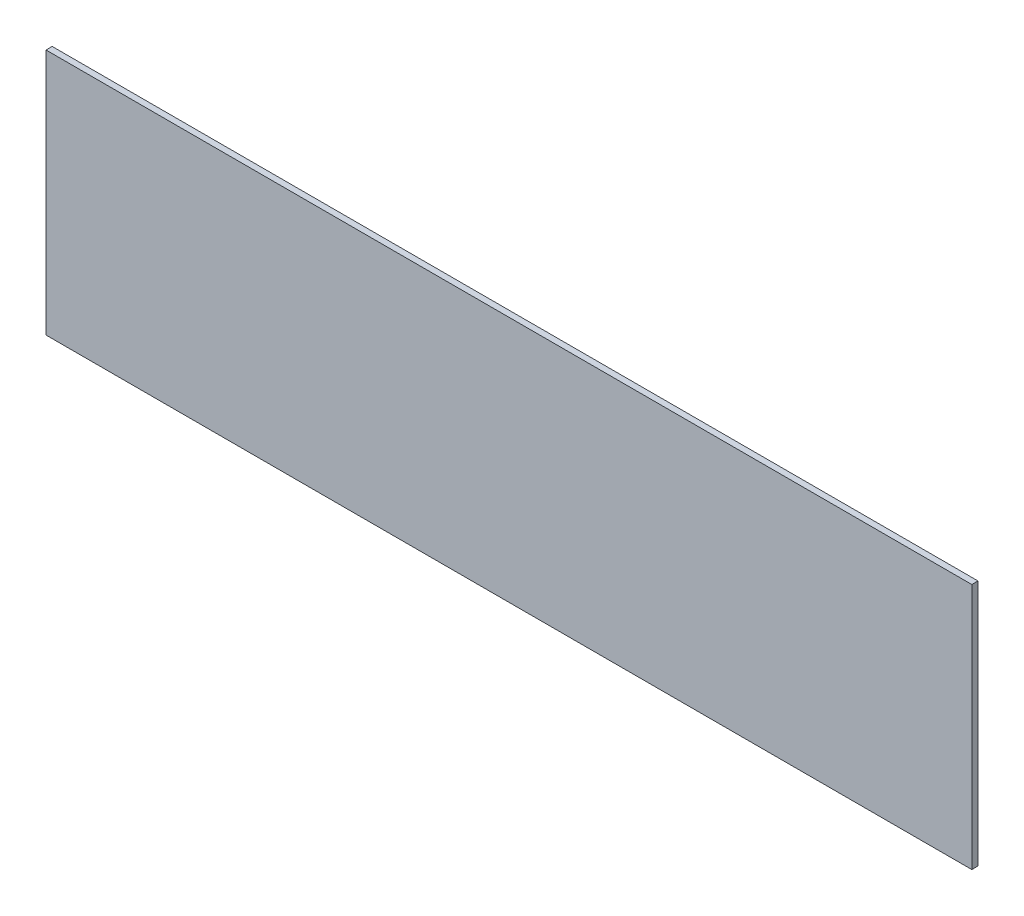
ISO-10303-21;
HEADER;
FILE_DESCRIPTION(('STEP AP214'),'2;1');
FILE_NAME('part.step','',(''),(''),'','','');
FILE_SCHEMA(('AUTOMOTIVE_DESIGN { 1 0 10303 214 1 1 1 1 }'));
ENDSEC;
DATA;
#1=APPLICATION_CONTEXT('core data for automotive mechanical design processes');
#2=APPLICATION_PROTOCOL_DEFINITION('international standard','automotive_design',2000,#1);
#3=PRODUCT_CONTEXT('',#1,'mechanical');
#4=PRODUCT('Part','Part','',(#3));
#5=PRODUCT_RELATED_PRODUCT_CATEGORY('part','',(#4));
#6=PRODUCT_DEFINITION_FORMATION('','',#4);
#7=PRODUCT_DEFINITION_CONTEXT('part definition',#1,'design');
#8=PRODUCT_DEFINITION('design','',#6,#7);
#9=PRODUCT_DEFINITION_SHAPE('','',#8);
#10=(LENGTH_UNIT() NAMED_UNIT(*) SI_UNIT(.MILLI.,.METRE.));
#11=(NAMED_UNIT(*) PLANE_ANGLE_UNIT() SI_UNIT($,.RADIAN.));
#12=(NAMED_UNIT(*) SI_UNIT($,.STERADIAN.) SOLID_ANGLE_UNIT());
#13=UNCERTAINTY_MEASURE_WITH_UNIT(LENGTH_MEASURE(1.E-05),#10,'distance_accuracy_value','');
#14=(GEOMETRIC_REPRESENTATION_CONTEXT(3) GLOBAL_UNCERTAINTY_ASSIGNED_CONTEXT((#13)) GLOBAL_UNIT_ASSIGNED_CONTEXT((#10,
#11,#12)) REPRESENTATION_CONTEXT('',''));
#15=CARTESIAN_POINT('',(0.,0.,0.));
#16=DIRECTION('',(0.,0.,1.));
#17=DIRECTION('',(1.,0.,0.));
#18=AXIS2_PLACEMENT_3D('',#15,#16,#17);
#19=CARTESIAN_POINT('',(-750.,-200.,10.));
#20=DIRECTION('',(1.,0.,0.));
#21=DIRECTION('',(0.,0.,-1.));
#22=AXIS2_PLACEMENT_3D('',#19,#20,#21);
#23=PLANE('',#22);
#24=DIRECTION('',(0.,-1.,0.));
#25=VECTOR('',#24,1.);
#26=CARTESIAN_POINT('',(-750.,-200.,0.));
#27=LINE('',#26,#25);
#28=CARTESIAN_POINT('',(-750.,200.,0.));
#29=VERTEX_POINT('',#28);
#30=CARTESIAN_POINT('',(-750.,-200.,0.));
#31=VERTEX_POINT('',#30);
#32=EDGE_CURVE('E100',#29,#31,#27,.T.);
#33=ORIENTED_EDGE('',*,*,#32,.T.);
#34=DIRECTION('',(0.,0.,-1.));
#35=VECTOR('',#34,1.);
#36=CARTESIAN_POINT('',(-750.,-200.,10.));
#37=LINE('',#36,#35);
#38=CARTESIAN_POINT('',(-750.,-200.,10.));
#39=VERTEX_POINT('',#38);
#40=EDGE_CURVE('E11',#39,#31,#37,.T.);
#41=ORIENTED_EDGE('',*,*,#40,.F.);
#42=DIRECTION('',(0.,-1.,0.));
#43=VECTOR('',#42,1.);
#44=CARTESIAN_POINT('',(-750.,-200.,10.));
#45=LINE('',#44,#43);
#46=CARTESIAN_POINT('',(-750.,200.,10.));
#47=VERTEX_POINT('',#46);
#48=EDGE_CURVE('E88',#47,#39,#45,.T.);
#49=ORIENTED_EDGE('',*,*,#48,.F.);
#50=DIRECTION('',(0.,0.,-1.));
#51=VECTOR('',#50,1.);
#52=CARTESIAN_POINT('',(-750.,200.,10.));
#53=LINE('',#52,#51);
#54=EDGE_CURVE('E96',#47,#29,#53,.T.);
#55=ORIENTED_EDGE('',*,*,#54,.T.);
#56=EDGE_LOOP('',(#33,#41,#49,#55));
#57=FACE_BOUND('',#56,.T.);
#58=ADVANCED_FACE('F37',(#57),#23,.F.);
#59=CARTESIAN_POINT('',(750.,-200.,10.));
#60=DIRECTION('',(0.,1.,0.));
#61=DIRECTION('',(-1.,0.,0.));
#62=AXIS2_PLACEMENT_3D('',#59,#60,#61);
#63=PLANE('',#62);
#64=DIRECTION('',(1.,0.,0.));
#65=VECTOR('',#64,1.);
#66=CARTESIAN_POINT('',(750.,-200.,0.));
#67=LINE('',#66,#65);
#68=CARTESIAN_POINT('',(750.,-200.,0.));
#69=VERTEX_POINT('',#68);
#70=EDGE_CURVE('E92',#31,#69,#67,.T.);
#71=ORIENTED_EDGE('',*,*,#70,.T.);
#72=DIRECTION('',(0.,0.,-1.));
#73=VECTOR('',#72,1.);
#74=CARTESIAN_POINT('',(750.,-200.,10.));
#75=LINE('',#74,#73);
#76=CARTESIAN_POINT('',(750.,-200.,10.));
#77=VERTEX_POINT('',#76);
#78=EDGE_CURVE('E45',#77,#69,#75,.T.);
#79=ORIENTED_EDGE('',*,*,#78,.F.);
#80=DIRECTION('',(1.,0.,0.));
#81=VECTOR('',#80,1.);
#82=CARTESIAN_POINT('',(750.,-200.,10.));
#83=LINE('',#82,#81);
#84=EDGE_CURVE('E83',#39,#77,#83,.T.);
#85=ORIENTED_EDGE('',*,*,#84,.F.);
#86=ORIENTED_EDGE('',*,*,#40,.T.);
#87=EDGE_LOOP('',(#71,#79,#85,#86));
#88=FACE_BOUND('',#87,.T.);
#89=ADVANCED_FACE('F91',(#88),#63,.F.);
#90=CARTESIAN_POINT('',(750.,-200.,10.));
#91=DIRECTION('',(-1.,0.,0.));
#92=DIRECTION('',(0.,0.,1.));
#93=AXIS2_PLACEMENT_3D('',#90,#91,#92);
#94=PLANE('',#93);
#95=DIRECTION('',(0.,1.,0.));
#96=VECTOR('',#95,1.);
#97=CARTESIAN_POINT('',(750.,-200.,0.));
#98=LINE('',#97,#96);
#99=CARTESIAN_POINT('',(750.,200.,0.));
#100=VERTEX_POINT('',#99);
#101=EDGE_CURVE('E70',#69,#100,#98,.T.);
#102=ORIENTED_EDGE('',*,*,#101,.T.);
#103=DIRECTION('',(0.,0.,-1.));
#104=VECTOR('',#103,1.);
#105=CARTESIAN_POINT('',(750.,200.,10.));
#106=LINE('',#105,#104);
#107=CARTESIAN_POINT('',(750.,200.,10.));
#108=VERTEX_POINT('',#107);
#109=EDGE_CURVE('E93',#108,#100,#106,.T.);
#110=ORIENTED_EDGE('',*,*,#109,.F.);
#111=DIRECTION('',(0.,1.,0.));
#112=VECTOR('',#111,1.);
#113=CARTESIAN_POINT('',(750.,-200.,10.));
#114=LINE('',#113,#112);
#115=EDGE_CURVE('E86',#77,#108,#114,.T.);
#116=ORIENTED_EDGE('',*,*,#115,.F.);
#117=ORIENTED_EDGE('',*,*,#78,.T.);
#118=EDGE_LOOP('',(#102,#110,#116,#117));
#119=FACE_BOUND('',#118,.T.);
#120=ADVANCED_FACE('F94',(#119),#94,.F.);
#121=CARTESIAN_POINT('',(750.,200.,10.));
#122=DIRECTION('',(0.,-1.,0.));
#123=DIRECTION('',(1.,0.,0.));
#124=AXIS2_PLACEMENT_3D('',#121,#122,#123);
#125=PLANE('',#124);
#126=DIRECTION('',(-1.,0.,0.));
#127=VECTOR('',#126,1.);
#128=CARTESIAN_POINT('',(750.,200.,0.));
#129=LINE('',#128,#127);
#130=EDGE_CURVE('E76',#100,#29,#129,.T.);
#131=ORIENTED_EDGE('',*,*,#130,.T.);
#132=ORIENTED_EDGE('',*,*,#54,.F.);
#133=DIRECTION('',(-1.,0.,0.));
#134=VECTOR('',#133,1.);
#135=CARTESIAN_POINT('',(750.,200.,10.));
#136=LINE('',#135,#134);
#137=EDGE_CURVE('E53',#108,#47,#136,.T.);
#138=ORIENTED_EDGE('',*,*,#137,.F.);
#139=ORIENTED_EDGE('',*,*,#109,.T.);
#140=EDGE_LOOP('',(#131,#132,#138,#139));
#141=FACE_BOUND('',#140,.T.);
#142=ADVANCED_FACE('F107',(#141),#125,.F.);
#143=CARTESIAN_POINT('',(0.,0.,10.));
#144=DIRECTION('',(0.,0.,1.));
#145=DIRECTION('',(1.,0.,0.));
#146=AXIS2_PLACEMENT_3D('',#143,#144,#145);
#147=PLANE('',#146);
#148=ORIENTED_EDGE('',*,*,#48,.T.);
#149=ORIENTED_EDGE('',*,*,#84,.T.);
#150=ORIENTED_EDGE('',*,*,#115,.T.);
#151=ORIENTED_EDGE('',*,*,#137,.T.);
#152=EDGE_LOOP('',(#148,#149,#150,#151));
#153=FACE_BOUND('',#152,.T.);
#154=ADVANCED_FACE('F84',(#153),#147,.T.);
#155=CARTESIAN_POINT('',(0.,0.,0.));
#156=DIRECTION('',(0.,0.,1.));
#157=DIRECTION('',(1.,0.,0.));
#158=AXIS2_PLACEMENT_3D('',#155,#156,#157);
#159=PLANE('',#158);
#160=ORIENTED_EDGE('',*,*,#32,.F.);
#161=ORIENTED_EDGE('',*,*,#130,.F.);
#162=ORIENTED_EDGE('',*,*,#101,.F.);
#163=ORIENTED_EDGE('',*,*,#70,.F.);
#164=EDGE_LOOP('',(#160,#161,#162,#163));
#165=FACE_BOUND('',#164,.T.);
#166=ADVANCED_FACE('F110',(#165),#159,.F.);
#167=CLOSED_SHELL('',(#58,#89,#120,#142,#154,#166));
#168=MANIFOLD_SOLID_BREP('B2',#167);
#169=ADVANCED_BREP_SHAPE_REPRESENTATION('',(#18,#168),#14);
#170=SHAPE_DEFINITION_REPRESENTATION(#9,#169);
ENDSEC;
END-ISO-10303-21;
